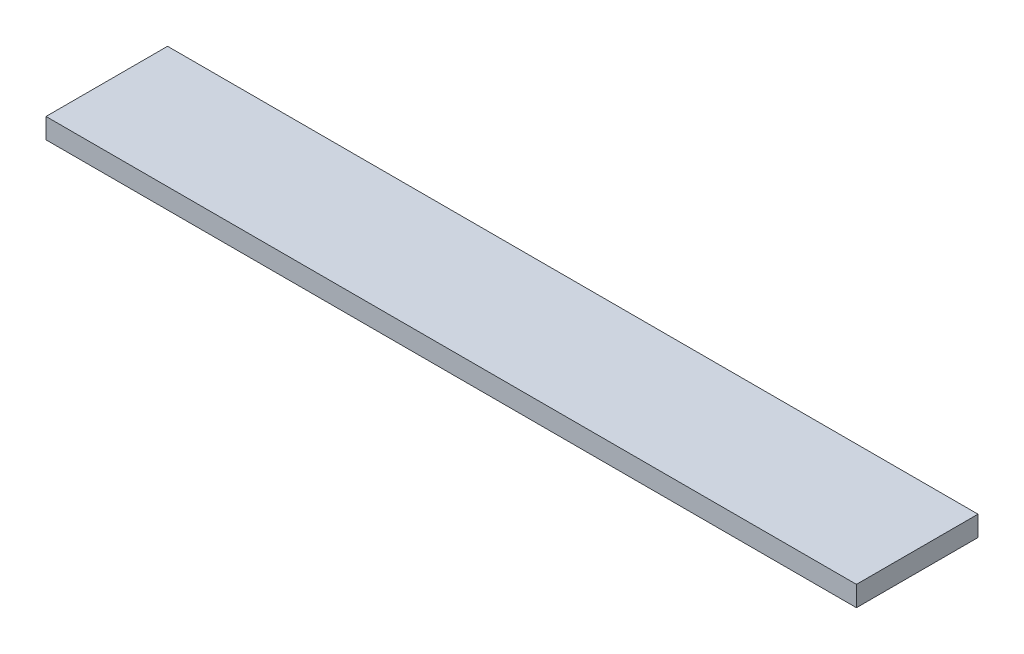
ISO-10303-21;
HEADER;
FILE_DESCRIPTION(('STEP AP214'),'2;1');
FILE_NAME('part.step','',(''),(''),'','','');
FILE_SCHEMA(('AUTOMOTIVE_DESIGN { 1 0 10303 214 1 1 1 1 }'));
ENDSEC;
DATA;
#1=APPLICATION_CONTEXT('core data for automotive mechanical design processes');
#2=APPLICATION_PROTOCOL_DEFINITION('international standard','automotive_design',2000,#1);
#3=PRODUCT_CONTEXT('',#1,'mechanical');
#4=PRODUCT('Part','Part','',(#3));
#5=PRODUCT_RELATED_PRODUCT_CATEGORY('part','',(#4));
#6=PRODUCT_DEFINITION_FORMATION('','',#4);
#7=PRODUCT_DEFINITION_CONTEXT('part definition',#1,'design');
#8=PRODUCT_DEFINITION('design','',#6,#7);
#9=PRODUCT_DEFINITION_SHAPE('','',#8);
#10=(LENGTH_UNIT() NAMED_UNIT(*) SI_UNIT(.MILLI.,.METRE.));
#11=(NAMED_UNIT(*) PLANE_ANGLE_UNIT() SI_UNIT($,.RADIAN.));
#12=(NAMED_UNIT(*) SI_UNIT($,.STERADIAN.) SOLID_ANGLE_UNIT());
#13=UNCERTAINTY_MEASURE_WITH_UNIT(LENGTH_MEASURE(1.E-05),#10,'distance_accuracy_value','');
#14=(GEOMETRIC_REPRESENTATION_CONTEXT(3) GLOBAL_UNCERTAINTY_ASSIGNED_CONTEXT((#13)) GLOBAL_UNIT_ASSIGNED_CONTEXT((#10,
#11,#12)) REPRESENTATION_CONTEXT('',''));
#15=CARTESIAN_POINT('',(0.,0.,0.));
#16=DIRECTION('',(0.,0.,1.));
#17=DIRECTION('',(1.,0.,0.));
#18=AXIS2_PLACEMENT_3D('',#15,#16,#17);
#19=CARTESIAN_POINT('',(1016.,-12.7,-76.2));
#20=DIRECTION('',(0.,0.,1.));
#21=DIRECTION('',(1.,0.,0.));
#22=AXIS2_PLACEMENT_3D('',#19,#20,#21);
#23=PLANE('',#22);
#24=DIRECTION('',(0.,1.,0.));
#25=VECTOR('',#24,1.);
#26=CARTESIAN_POINT('',(0.,-12.7,-76.2));
#27=LINE('',#26,#25);
#28=CARTESIAN_POINT('',(0.,-12.7,-76.2));
#29=VERTEX_POINT('',#28);
#30=CARTESIAN_POINT('',(0.,12.7,-76.2));
#31=VERTEX_POINT('',#30);
#32=EDGE_CURVE('E95',#29,#31,#27,.T.);
#33=ORIENTED_EDGE('',*,*,#32,.T.);
#34=DIRECTION('',(-1.,0.,0.));
#35=VECTOR('',#34,1.);
#36=CARTESIAN_POINT('',(1016.,12.7,-76.2));
#37=LINE('',#36,#35);
#38=CARTESIAN_POINT('',(1016.,12.7,-76.2));
#39=VERTEX_POINT('',#38);
#40=EDGE_CURVE('E11',#39,#31,#37,.T.);
#41=ORIENTED_EDGE('',*,*,#40,.F.);
#42=DIRECTION('',(0.,1.,0.));
#43=VECTOR('',#42,1.);
#44=CARTESIAN_POINT('',(1016.,-12.7,-76.2));
#45=LINE('',#44,#43);
#46=CARTESIAN_POINT('',(1016.,-12.7,-76.2));
#47=VERTEX_POINT('',#46);
#48=EDGE_CURVE('E83',#47,#39,#45,.T.);
#49=ORIENTED_EDGE('',*,*,#48,.F.);
#50=DIRECTION('',(-1.,0.,0.));
#51=VECTOR('',#50,1.);
#52=CARTESIAN_POINT('',(1016.,-12.7,-76.2));
#53=LINE('',#52,#51);
#54=EDGE_CURVE('E91',#47,#29,#53,.T.);
#55=ORIENTED_EDGE('',*,*,#54,.T.);
#56=EDGE_LOOP('',(#33,#41,#49,#55));
#57=FACE_BOUND('',#56,.T.);
#58=ADVANCED_FACE('F32',(#57),#23,.F.);
#59=CARTESIAN_POINT('',(1016.,12.7,76.2));
#60=DIRECTION('',(0.,-1.,0.));
#61=DIRECTION('',(0.,0.,-1.));
#62=AXIS2_PLACEMENT_3D('',#59,#60,#61);
#63=PLANE('',#62);
#64=DIRECTION('',(0.,0.,1.));
#65=VECTOR('',#64,1.);
#66=CARTESIAN_POINT('',(0.,12.7,76.2));
#67=LINE('',#66,#65);
#68=CARTESIAN_POINT('',(0.,12.7,76.2));
#69=VERTEX_POINT('',#68);
#70=EDGE_CURVE('E87',#31,#69,#67,.T.);
#71=ORIENTED_EDGE('',*,*,#70,.T.);
#72=DIRECTION('',(-1.,0.,0.));
#73=VECTOR('',#72,1.);
#74=CARTESIAN_POINT('',(1016.,12.7,76.2));
#75=LINE('',#74,#73);
#76=CARTESIAN_POINT('',(1016.,12.7,76.2));
#77=VERTEX_POINT('',#76);
#78=EDGE_CURVE('E40',#77,#69,#75,.T.);
#79=ORIENTED_EDGE('',*,*,#78,.F.);
#80=DIRECTION('',(0.,0.,1.));
#81=VECTOR('',#80,1.);
#82=CARTESIAN_POINT('',(1016.,12.7,76.2));
#83=LINE('',#82,#81);
#84=EDGE_CURVE('E78',#39,#77,#83,.T.);
#85=ORIENTED_EDGE('',*,*,#84,.F.);
#86=ORIENTED_EDGE('',*,*,#40,.T.);
#87=EDGE_LOOP('',(#71,#79,#85,#86));
#88=FACE_BOUND('',#87,.T.);
#89=ADVANCED_FACE('F86',(#88),#63,.F.);
#90=CARTESIAN_POINT('',(1016.,-12.7,76.2));
#91=DIRECTION('',(0.,0.,-1.));
#92=DIRECTION('',(-1.,0.,0.));
#93=AXIS2_PLACEMENT_3D('',#90,#91,#92);
#94=PLANE('',#93);
#95=DIRECTION('',(0.,-1.,0.));
#96=VECTOR('',#95,1.);
#97=CARTESIAN_POINT('',(0.,-12.7,76.2));
#98=LINE('',#97,#96);
#99=CARTESIAN_POINT('',(0.,-12.7,76.2));
#100=VERTEX_POINT('',#99);
#101=EDGE_CURVE('E65',#69,#100,#98,.T.);
#102=ORIENTED_EDGE('',*,*,#101,.T.);
#103=DIRECTION('',(-1.,0.,0.));
#104=VECTOR('',#103,1.);
#105=CARTESIAN_POINT('',(1016.,-12.7,76.2));
#106=LINE('',#105,#104);
#107=CARTESIAN_POINT('',(1016.,-12.7,76.2));
#108=VERTEX_POINT('',#107);
#109=EDGE_CURVE('E88',#108,#100,#106,.T.);
#110=ORIENTED_EDGE('',*,*,#109,.F.);
#111=DIRECTION('',(0.,-1.,0.));
#112=VECTOR('',#111,1.);
#113=CARTESIAN_POINT('',(1016.,-12.7,76.2));
#114=LINE('',#113,#112);
#115=EDGE_CURVE('E81',#77,#108,#114,.T.);
#116=ORIENTED_EDGE('',*,*,#115,.F.);
#117=ORIENTED_EDGE('',*,*,#78,.T.);
#118=EDGE_LOOP('',(#102,#110,#116,#117));
#119=FACE_BOUND('',#118,.T.);
#120=ADVANCED_FACE('F89',(#119),#94,.F.);
#121=CARTESIAN_POINT('',(1016.,-12.7,76.2));
#122=DIRECTION('',(0.,1.,0.));
#123=DIRECTION('',(0.,0.,1.));
#124=AXIS2_PLACEMENT_3D('',#121,#122,#123);
#125=PLANE('',#124);
#126=DIRECTION('',(0.,0.,-1.));
#127=VECTOR('',#126,1.);
#128=CARTESIAN_POINT('',(0.,-12.7,76.2));
#129=LINE('',#128,#127);
#130=EDGE_CURVE('E71',#100,#29,#129,.T.);
#131=ORIENTED_EDGE('',*,*,#130,.T.);
#132=ORIENTED_EDGE('',*,*,#54,.F.);
#133=DIRECTION('',(0.,0.,-1.));
#134=VECTOR('',#133,1.);
#135=CARTESIAN_POINT('',(1016.,-12.7,76.2));
#136=LINE('',#135,#134);
#137=EDGE_CURVE('E48',#108,#47,#136,.T.);
#138=ORIENTED_EDGE('',*,*,#137,.F.);
#139=ORIENTED_EDGE('',*,*,#109,.T.);
#140=EDGE_LOOP('',(#131,#132,#138,#139));
#141=FACE_BOUND('',#140,.T.);
#142=ADVANCED_FACE('F102',(#141),#125,.F.);
#143=CARTESIAN_POINT('',(1016.,0.,0.));
#144=DIRECTION('',(-1.,0.,0.));
#145=DIRECTION('',(0.,0.,1.));
#146=AXIS2_PLACEMENT_3D('',#143,#144,#145);
#147=PLANE('',#146);
#148=ORIENTED_EDGE('',*,*,#48,.T.);
#149=ORIENTED_EDGE('',*,*,#84,.T.);
#150=ORIENTED_EDGE('',*,*,#115,.T.);
#151=ORIENTED_EDGE('',*,*,#137,.T.);
#152=EDGE_LOOP('',(#148,#149,#150,#151));
#153=FACE_BOUND('',#152,.T.);
#154=ADVANCED_FACE('F79',(#153),#147,.F.);
#155=CARTESIAN_POINT('',(0.,0.,0.));
#156=DIRECTION('',(-1.,0.,0.));
#157=DIRECTION('',(0.,0.,1.));
#158=AXIS2_PLACEMENT_3D('',#155,#156,#157);
#159=PLANE('',#158);
#160=ORIENTED_EDGE('',*,*,#32,.F.);
#161=ORIENTED_EDGE('',*,*,#130,.F.);
#162=ORIENTED_EDGE('',*,*,#101,.F.);
#163=ORIENTED_EDGE('',*,*,#70,.F.);
#164=EDGE_LOOP('',(#160,#161,#162,#163));
#165=FACE_BOUND('',#164,.T.);
#166=ADVANCED_FACE('F105',(#165),#159,.T.);
#167=CLOSED_SHELL('',(#58,#89,#120,#142,#154,#166));
#168=MANIFOLD_SOLID_BREP('B2',#167);
#169=ADVANCED_BREP_SHAPE_REPRESENTATION('',(#18,#168),#14);
#170=SHAPE_DEFINITION_REPRESENTATION(#9,#169);
ENDSEC;
END-ISO-10303-21;
